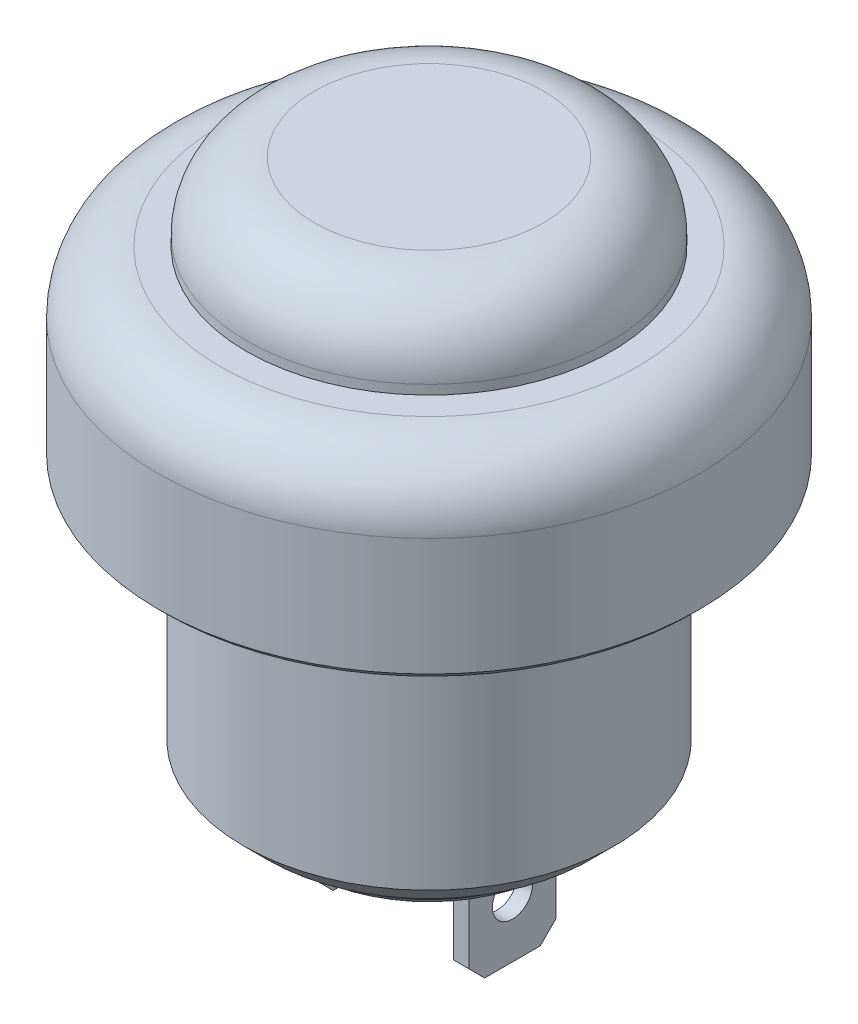
ISO-10303-21;
HEADER;
FILE_DESCRIPTION(('STEP AP214'),'2;1');
FILE_NAME('part.step','',(''),(''),'','','');
FILE_SCHEMA(('AUTOMOTIVE_DESIGN { 1 0 10303 214 1 1 1 1 }'));
ENDSEC;
DATA;
#1=APPLICATION_CONTEXT('core data for automotive mechanical design processes');
#2=APPLICATION_PROTOCOL_DEFINITION('international standard','automotive_design',2000,#1);
#3=PRODUCT_CONTEXT('',#1,'mechanical');
#4=PRODUCT('Part','Part','',(#3));
#5=PRODUCT_RELATED_PRODUCT_CATEGORY('part','',(#4));
#6=PRODUCT_DEFINITION_FORMATION('','',#4);
#7=PRODUCT_DEFINITION_CONTEXT('part definition',#1,'design');
#8=PRODUCT_DEFINITION('design','',#6,#7);
#9=PRODUCT_DEFINITION_SHAPE('','',#8);
#10=(LENGTH_UNIT() NAMED_UNIT(*) SI_UNIT(.MILLI.,.METRE.));
#11=(NAMED_UNIT(*) PLANE_ANGLE_UNIT() SI_UNIT($,.RADIAN.));
#12=(NAMED_UNIT(*) SI_UNIT($,.STERADIAN.) SOLID_ANGLE_UNIT());
#13=UNCERTAINTY_MEASURE_WITH_UNIT(LENGTH_MEASURE(1.E-05),#10,'distance_accuracy_value','');
#14=(GEOMETRIC_REPRESENTATION_CONTEXT(3) GLOBAL_UNCERTAINTY_ASSIGNED_CONTEXT((#13)) GLOBAL_UNIT_ASSIGNED_CONTEXT((#10,
#11,#12)) REPRESENTATION_CONTEXT('',''));
#15=CARTESIAN_POINT('',(0.,0.,0.));
#16=DIRECTION('',(0.,0.,1.));
#17=DIRECTION('',(1.,0.,0.));
#18=AXIS2_PLACEMENT_3D('',#15,#16,#17);
#19=CARTESIAN_POINT('',(0.,18.,0.));
#20=DIRECTION('',(0.,1.,0.));
#21=DIRECTION('',(0.,0.,1.));
#22=AXIS2_PLACEMENT_3D('',#19,#20,#21);
#23=PLANE('',#22);
#24=CARTESIAN_POINT('',(0.,18.,0.));
#25=DIRECTION('',(0.,-1.,0.));
#26=DIRECTION('',(1.,0.,0.));
#27=AXIS2_PLACEMENT_3D('',#24,#25,#26);
#28=CIRCLE('',#27,3.7);
#29=CARTESIAN_POINT('',(3.7,18.,0.));
#30=VERTEX_POINT('',#29);
#31=EDGE_CURVE('E208',#30,#30,#28,.T.);
#32=ORIENTED_EDGE('',*,*,#31,.F.);
#33=EDGE_LOOP('',(#32));
#34=FACE_BOUND('',#33,.T.);
#35=ADVANCED_FACE('F17',(#34),#23,.T.);
#36=CARTESIAN_POINT('',(0.,15.8,0.));
#37=DIRECTION('',(0.,1.,0.));
#38=DIRECTION('',(0.,0.,1.));
#39=AXIS2_PLACEMENT_3D('',#36,#37,#38);
#40=TOROIDAL_SURFACE('',#39,3.7,2.2);
#41=ORIENTED_EDGE('',*,*,#31,.T.);
#42=EDGE_LOOP('',(#41));
#43=FACE_BOUND('',#42,.T.);
#44=CARTESIAN_POINT('',(0.,15.8,0.));
#45=DIRECTION('',(0.,-1.,0.));
#46=DIRECTION('',(0.,0.,-1.));
#47=AXIS2_PLACEMENT_3D('',#44,#45,#46);
#48=CIRCLE('',#47,5.9);
#49=CARTESIAN_POINT('',(0.,15.8,-5.9));
#50=VERTEX_POINT('',#49);
#51=EDGE_CURVE('E199',#50,#50,#48,.T.);
#52=ORIENTED_EDGE('',*,*,#51,.F.);
#53=EDGE_LOOP('',(#52));
#54=FACE_BOUND('',#53,.T.);
#55=ADVANCED_FACE('F215',(#43,#54),#40,.T.);
#56=CARTESIAN_POINT('',(0.,18.,0.));
#57=DIRECTION('',(0.,-1.,0.));
#58=DIRECTION('',(0.,0.,-1.));
#59=AXIS2_PLACEMENT_3D('',#56,#57,#58);
#60=CYLINDRICAL_SURFACE('',#59,5.9);
#61=ORIENTED_EDGE('',*,*,#51,.T.);
#62=EDGE_LOOP('',(#61));
#63=FACE_BOUND('',#62,.T.);
#64=CARTESIAN_POINT('',(0.,15.5,0.));
#65=DIRECTION('',(0.,-1.,0.));
#66=DIRECTION('',(0.,0.,-1.));
#67=AXIS2_PLACEMENT_3D('',#64,#65,#66);
#68=CIRCLE('',#67,5.9);
#69=CARTESIAN_POINT('',(0.,15.5,-5.9));
#70=VERTEX_POINT('',#69);
#71=EDGE_CURVE('E21',#70,#70,#68,.T.);
#72=ORIENTED_EDGE('',*,*,#71,.F.);
#73=EDGE_LOOP('',(#72));
#74=FACE_BOUND('',#73,.T.);
#75=ADVANCED_FACE('F218',(#63,#74),#60,.T.);
#76=CARTESIAN_POINT('',(0.,15.5,0.));
#77=DIRECTION('',(0.,1.,0.));
#78=DIRECTION('',(0.,0.,1.));
#79=AXIS2_PLACEMENT_3D('',#76,#77,#78);
#80=PLANE('',#79);
#81=ORIENTED_EDGE('',*,*,#71,.T.);
#82=EDGE_LOOP('',(#81));
#83=FACE_BOUND('',#82,.T.);
#84=CARTESIAN_POINT('',(0.,15.5,0.));
#85=DIRECTION('',(0.,-1.,0.));
#86=DIRECTION('',(1.,0.,0.));
#87=AXIS2_PLACEMENT_3D('',#84,#85,#86);
#88=CIRCLE('',#87,6.75);
#89=CARTESIAN_POINT('',(6.75,15.5,0.));
#90=VERTEX_POINT('',#89);
#91=EDGE_CURVE('E177',#90,#90,#88,.T.);
#92=ORIENTED_EDGE('',*,*,#91,.F.);
#93=EDGE_LOOP('',(#92));
#94=FACE_BOUND('',#93,.T.);
#95=ADVANCED_FACE('F188',(#83,#94),#80,.T.);
#96=CARTESIAN_POINT('',(0.,13.5,0.));
#97=DIRECTION('',(0.,-1.,0.));
#98=DIRECTION('',(0.,0.,-1.));
#99=AXIS2_PLACEMENT_3D('',#96,#97,#98);
#100=TOROIDAL_SURFACE('',#99,6.75,2.);
#101=CARTESIAN_POINT('',(0.,13.5,0.));
#102=DIRECTION('',(0.,1.,0.));
#103=DIRECTION('',(0.,0.,1.));
#104=AXIS2_PLACEMENT_3D('',#101,#102,#103);
#105=CIRCLE('',#104,8.75);
#106=CARTESIAN_POINT('',(0.,13.5,8.75));
#107=VERTEX_POINT('',#106);
#108=EDGE_CURVE('E135',#107,#107,#105,.F.);
#109=ORIENTED_EDGE('',*,*,#108,.F.);
#110=EDGE_LOOP('',(#109));
#111=FACE_BOUND('',#110,.T.);
#112=ORIENTED_EDGE('',*,*,#91,.T.);
#113=EDGE_LOOP('',(#112));
#114=FACE_BOUND('',#113,.T.);
#115=ADVANCED_FACE('F183',(#111,#114),#100,.T.);
#116=CARTESIAN_POINT('',(2.575,-2.95,1.15));
#117=DIRECTION('',(0.,-0.707106781186548,0.707106781186547));
#118=DIRECTION('',(0.,-0.707106781186547,-0.707106781186548));
#119=AXIS2_PLACEMENT_3D('',#116,#117,#118);
#120=PLANE('',#119);
#121=DIRECTION('',(0.,-0.707106781186548,-0.707106781186548));
#122=VECTOR('',#121,1.);
#123=CARTESIAN_POINT('',(2.7,-2.7,1.4));
#124=LINE('',#123,#122);
#125=CARTESIAN_POINT('',(2.7,-2.7,1.4));
#126=VERTEX_POINT('',#125);
#127=CARTESIAN_POINT('',(2.7,-3.2,0.9));
#128=VERTEX_POINT('',#127);
#129=EDGE_CURVE('E112',#126,#128,#124,.T.);
#130=ORIENTED_EDGE('',*,*,#129,.F.);
#131=DIRECTION('',(1.,0.,0.));
#132=VECTOR('',#131,1.);
#133=CARTESIAN_POINT('',(2.7,-2.7,1.4));
#134=LINE('',#133,#132);
#135=CARTESIAN_POINT('',(2.2,-2.7,1.4));
#136=VERTEX_POINT('',#135);
#137=EDGE_CURVE('E108',#136,#126,#134,.T.);
#138=ORIENTED_EDGE('',*,*,#137,.F.);
#139=DIRECTION('',(0.,0.707106781186548,0.707106781186548));
#140=VECTOR('',#139,1.);
#141=CARTESIAN_POINT('',(2.2,-3.2,0.9));
#142=LINE('',#141,#140);
#143=CARTESIAN_POINT('',(2.2,-3.2,0.9));
#144=VERTEX_POINT('',#143);
#145=EDGE_CURVE('E105',#144,#136,#142,.T.);
#146=ORIENTED_EDGE('',*,*,#145,.F.);
#147=DIRECTION('',(1.,0.,0.));
#148=VECTOR('',#147,1.);
#149=CARTESIAN_POINT('',(2.45,-3.2,0.9));
#150=LINE('',#149,#148);
#151=EDGE_CURVE('E174',#144,#128,#150,.T.);
#152=ORIENTED_EDGE('',*,*,#151,.T.);
#153=EDGE_LOOP('',(#130,#138,#146,#152));
#154=FACE_BOUND('',#153,.T.);
#155=ADVANCED_FACE('F110',(#154),#120,.T.);
#156=CARTESIAN_POINT('',(2.45,-3.2,0.));
#157=DIRECTION('',(0.,1.,0.));
#158=DIRECTION('',(0.,0.,1.));
#159=AXIS2_PLACEMENT_3D('',#156,#157,#158);
#160=PLANE('',#159);
#161=DIRECTION('',(0.,0.,1.));
#162=VECTOR('',#161,1.);
#163=CARTESIAN_POINT('',(2.2,-3.2,1.4));
#164=LINE('',#163,#162);
#165=CARTESIAN_POINT('',(2.2,-3.2,-0.9));
#166=VERTEX_POINT('',#165);
#167=EDGE_CURVE('E133',#166,#144,#164,.T.);
#168=ORIENTED_EDGE('',*,*,#167,.F.);
#169=DIRECTION('',(1.,0.,0.));
#170=VECTOR('',#169,1.);
#171=CARTESIAN_POINT('',(2.325,-3.2,-0.9));
#172=LINE('',#171,#170);
#173=CARTESIAN_POINT('',(2.7,-3.2,-0.9));
#174=VERTEX_POINT('',#173);
#175=EDGE_CURVE('E171',#174,#166,#172,.F.);
#176=ORIENTED_EDGE('',*,*,#175,.F.);
#177=DIRECTION('',(0.,0.,-1.));
#178=VECTOR('',#177,1.);
#179=CARTESIAN_POINT('',(2.7,-3.2,-1.4));
#180=LINE('',#179,#178);
#181=EDGE_CURVE('E285',#128,#174,#180,.T.);
#182=ORIENTED_EDGE('',*,*,#181,.F.);
#183=ORIENTED_EDGE('',*,*,#151,.F.);
#184=EDGE_LOOP('',(#168,#176,#182,#183));
#185=FACE_BOUND('',#184,.T.);
#186=ADVANCED_FACE('F310',(#185),#160,.F.);
#187=CARTESIAN_POINT('',(2.325,-2.95,-1.15));
#188=DIRECTION('',(0.,-0.707106781186548,-0.707106781186547));
#189=DIRECTION('',(0.,0.707106781186547,-0.707106781186548));
#190=AXIS2_PLACEMENT_3D('',#187,#188,#189);
#191=PLANE('',#190);
#192=DIRECTION('',(0.,-0.707106781186548,0.707106781186548));
#193=VECTOR('',#192,1.);
#194=CARTESIAN_POINT('',(2.2,-2.7,-1.4));
#195=LINE('',#194,#193);
#196=CARTESIAN_POINT('',(2.2,-2.7,-1.4));
#197=VERTEX_POINT('',#196);
#198=EDGE_CURVE('E287',#197,#166,#195,.T.);
#199=ORIENTED_EDGE('',*,*,#198,.F.);
#200=DIRECTION('',(-1.,0.,0.));
#201=VECTOR('',#200,1.);
#202=CARTESIAN_POINT('',(2.2,-2.7,-1.4));
#203=LINE('',#202,#201);
#204=CARTESIAN_POINT('',(2.7,-2.7,-1.4));
#205=VERTEX_POINT('',#204);
#206=EDGE_CURVE('E168',#205,#197,#203,.T.);
#207=ORIENTED_EDGE('',*,*,#206,.F.);
#208=DIRECTION('',(0.,0.707106781186548,-0.707106781186548));
#209=VECTOR('',#208,1.);
#210=CARTESIAN_POINT('',(2.7,-3.2,-0.9));
#211=LINE('',#210,#209);
#212=EDGE_CURVE('E306',#174,#205,#211,.T.);
#213=ORIENTED_EDGE('',*,*,#212,.F.);
#214=ORIENTED_EDGE('',*,*,#175,.T.);
#215=EDGE_LOOP('',(#199,#207,#213,#214));
#216=FACE_BOUND('',#215,.T.);
#217=ADVANCED_FACE('F305',(#216),#191,.T.);
#218=CARTESIAN_POINT('',(2.2,0.,-1.4));
#219=DIRECTION('',(0.,0.,-1.));
#220=DIRECTION('',(-1.,0.,0.));
#221=AXIS2_PLACEMENT_3D('',#218,#219,#220);
#222=PLANE('',#221);
#223=DIRECTION('',(-1.,0.,0.));
#224=VECTOR('',#223,1.);
#225=CARTESIAN_POINT('',(2.2,0.,-1.4));
#226=LINE('',#225,#224);
#227=CARTESIAN_POINT('',(2.2,0.,-1.4));
#228=VERTEX_POINT('',#227);
#229=CARTESIAN_POINT('',(2.7,0.,-1.4));
#230=VERTEX_POINT('',#229);
#231=EDGE_CURVE('E118',#228,#230,#226,.F.);
#232=ORIENTED_EDGE('',*,*,#231,.T.);
#233=DIRECTION('',(0.,1.,0.));
#234=VECTOR('',#233,1.);
#235=CARTESIAN_POINT('',(2.7,0.,-1.4));
#236=LINE('',#235,#234);
#237=EDGE_CURVE('E301',#205,#230,#236,.T.);
#238=ORIENTED_EDGE('',*,*,#237,.F.);
#239=ORIENTED_EDGE('',*,*,#206,.T.);
#240=DIRECTION('',(0.,1.,0.));
#241=VECTOR('',#240,1.);
#242=CARTESIAN_POINT('',(2.2,0.,-1.4));
#243=LINE('',#242,#241);
#244=EDGE_CURVE('E127',#228,#197,#243,.F.);
#245=ORIENTED_EDGE('',*,*,#244,.F.);
#246=EDGE_LOOP('',(#232,#238,#239,#245));
#247=FACE_BOUND('',#246,.T.);
#248=ADVANCED_FACE('F298',(#247),#222,.T.);
#249=CARTESIAN_POINT('',(2.7,0.,1.4));
#250=DIRECTION('',(0.,0.,1.));
#251=DIRECTION('',(1.,0.,0.));
#252=AXIS2_PLACEMENT_3D('',#249,#250,#251);
#253=PLANE('',#252);
#254=DIRECTION('',(1.,0.,0.));
#255=VECTOR('',#254,1.);
#256=CARTESIAN_POINT('',(2.7,0.,1.4));
#257=LINE('',#256,#255);
#258=CARTESIAN_POINT('',(2.7,0.,1.4));
#259=VERTEX_POINT('',#258);
#260=CARTESIAN_POINT('',(2.2,0.,1.4));
#261=VERTEX_POINT('',#260);
#262=EDGE_CURVE('E117',#259,#261,#257,.F.);
#263=ORIENTED_EDGE('',*,*,#262,.T.);
#264=DIRECTION('',(0.,1.,0.));
#265=VECTOR('',#264,1.);
#266=CARTESIAN_POINT('',(2.2,0.,1.4));
#267=LINE('',#266,#265);
#268=EDGE_CURVE('E121',#136,#261,#267,.T.);
#269=ORIENTED_EDGE('',*,*,#268,.F.);
#270=ORIENTED_EDGE('',*,*,#137,.T.);
#271=DIRECTION('',(0.,1.,0.));
#272=VECTOR('',#271,1.);
#273=CARTESIAN_POINT('',(2.7,0.,1.4));
#274=LINE('',#273,#272);
#275=EDGE_CURVE('E277',#259,#126,#274,.F.);
#276=ORIENTED_EDGE('',*,*,#275,.F.);
#277=EDGE_LOOP('',(#263,#269,#270,#276));
#278=FACE_BOUND('',#277,.T.);
#279=ADVANCED_FACE('F122',(#278),#253,.T.);
#280=CARTESIAN_POINT('',(2.7,-1.35,0.));
#281=DIRECTION('',(-1.,0.,0.));
#282=DIRECTION('',(0.,0.,1.));
#283=AXIS2_PLACEMENT_3D('',#280,#281,#282);
#284=CYLINDRICAL_SURFACE('',#283,0.65);
#285=CARTESIAN_POINT('',(2.7,-1.35,0.));
#286=DIRECTION('',(-1.,0.,0.));
#287=DIRECTION('',(0.,0.,1.));
#288=AXIS2_PLACEMENT_3D('',#285,#286,#287);
#289=CIRCLE('',#288,0.65);
#290=CARTESIAN_POINT('',(2.7,-1.35,0.65));
#291=VERTEX_POINT('',#290);
#292=EDGE_CURVE('E273',#291,#291,#289,.T.);
#293=ORIENTED_EDGE('',*,*,#292,.F.);
#294=EDGE_LOOP('',(#293));
#295=FACE_BOUND('',#294,.T.);
#296=CARTESIAN_POINT('',(2.2,-1.35,0.));
#297=DIRECTION('',(-1.,0.,0.));
#298=DIRECTION('',(0.,0.,1.));
#299=AXIS2_PLACEMENT_3D('',#296,#297,#298);
#300=CIRCLE('',#299,0.65);
#301=CARTESIAN_POINT('',(2.2,-1.35,0.65));
#302=VERTEX_POINT('',#301);
#303=EDGE_CURVE('E278',#302,#302,#300,.F.);
#304=ORIENTED_EDGE('',*,*,#303,.F.);
#305=EDGE_LOOP('',(#304));
#306=FACE_BOUND('',#305,.T.);
#307=ADVANCED_FACE('F647',(#295,#306),#284,.F.);
#308=CARTESIAN_POINT('',(-2.575,-2.95,-1.15));
#309=DIRECTION('',(0.,-0.707106781186548,-0.707106781186548));
#310=DIRECTION('',(0.,0.707106781186548,-0.707106781186548));
#311=AXIS2_PLACEMENT_3D('',#308,#309,#310);
#312=PLANE('',#311);
#313=DIRECTION('',(0.,-0.707106781186548,0.707106781186547));
#314=VECTOR('',#313,1.);
#315=CARTESIAN_POINT('',(-2.7,-2.7,-1.4));
#316=LINE('',#315,#314);
#317=CARTESIAN_POINT('',(-2.7,-2.7,-1.4));
#318=VERTEX_POINT('',#317);
#319=CARTESIAN_POINT('',(-2.7,-3.2,-0.9));
#320=VERTEX_POINT('',#319);
#321=EDGE_CURVE('E271',#318,#320,#316,.T.);
#322=ORIENTED_EDGE('',*,*,#321,.F.);
#323=DIRECTION('',(-1.,0.,0.));
#324=VECTOR('',#323,1.);
#325=CARTESIAN_POINT('',(-2.7,-2.7,-1.4));
#326=LINE('',#325,#324);
#327=CARTESIAN_POINT('',(-2.2,-2.7,-1.4));
#328=VERTEX_POINT('',#327);
#329=EDGE_CURVE('E147',#328,#318,#326,.T.);
#330=ORIENTED_EDGE('',*,*,#329,.F.);
#331=DIRECTION('',(0.,0.707106781186548,-0.707106781186548));
#332=VECTOR('',#331,1.);
#333=CARTESIAN_POINT('',(-2.2,-3.2,-0.9));
#334=LINE('',#333,#332);
#335=CARTESIAN_POINT('',(-2.2,-3.2,-0.9));
#336=VERTEX_POINT('',#335);
#337=EDGE_CURVE('E276',#336,#328,#334,.T.);
#338=ORIENTED_EDGE('',*,*,#337,.F.);
#339=DIRECTION('',(1.,0.,0.));
#340=VECTOR('',#339,1.);
#341=CARTESIAN_POINT('',(-2.45,-3.2,-0.900000000000001));
#342=LINE('',#341,#340);
#343=EDGE_CURVE('E160',#320,#336,#342,.T.);
#344=ORIENTED_EDGE('',*,*,#343,.F.);
#345=EDGE_LOOP('',(#322,#330,#338,#344));
#346=FACE_BOUND('',#345,.T.);
#347=ADVANCED_FACE('F381',(#346),#312,.T.);
#348=CARTESIAN_POINT('',(-2.45,-3.2,0.));
#349=DIRECTION('',(0.,-1.,0.));
#350=DIRECTION('',(0.,0.,-1.));
#351=AXIS2_PLACEMENT_3D('',#348,#349,#350);
#352=PLANE('',#351);
#353=DIRECTION('',(1.,0.,0.));
#354=VECTOR('',#353,1.);
#355=CARTESIAN_POINT('',(-2.325,-3.2,0.899999999999999));
#356=LINE('',#355,#354);
#357=CARTESIAN_POINT('',(-2.7,-3.2,0.9));
#358=VERTEX_POINT('',#357);
#359=CARTESIAN_POINT('',(-2.2,-3.2,0.9));
#360=VERTEX_POINT('',#359);
#361=EDGE_CURVE('E157',#358,#360,#356,.T.);
#362=ORIENTED_EDGE('',*,*,#361,.F.);
#363=DIRECTION('',(0.,0.,1.));
#364=VECTOR('',#363,1.);
#365=CARTESIAN_POINT('',(-2.7,-3.2,1.4));
#366=LINE('',#365,#364);
#367=EDGE_CURVE('E354',#320,#358,#366,.T.);
#368=ORIENTED_EDGE('',*,*,#367,.F.);
#369=ORIENTED_EDGE('',*,*,#343,.T.);
#370=DIRECTION('',(0.,0.,-1.));
#371=VECTOR('',#370,1.);
#372=CARTESIAN_POINT('',(-2.2,-3.2,0.));
#373=LINE('',#372,#371);
#374=EDGE_CURVE('E272',#360,#336,#373,.T.);
#375=ORIENTED_EDGE('',*,*,#374,.F.);
#376=EDGE_LOOP('',(#362,#368,#369,#375));
#377=FACE_BOUND('',#376,.T.);
#378=ADVANCED_FACE('F384',(#377),#352,.T.);
#379=CARTESIAN_POINT('',(-2.325,-2.95,1.15));
#380=DIRECTION('',(0.,-0.707106781186548,0.707106781186548));
#381=DIRECTION('',(0.,-0.707106781186548,-0.707106781186548));
#382=AXIS2_PLACEMENT_3D('',#379,#380,#381);
#383=PLANE('',#382);
#384=DIRECTION('',(0.,-0.707106781186548,-0.707106781186548));
#385=VECTOR('',#384,1.);
#386=CARTESIAN_POINT('',(-2.2,-2.7,1.4));
#387=LINE('',#386,#385);
#388=CARTESIAN_POINT('',(-2.2,-2.7,1.4));
#389=VERTEX_POINT('',#388);
#390=EDGE_CURVE('E364',#389,#360,#387,.T.);
#391=ORIENTED_EDGE('',*,*,#390,.F.);
#392=DIRECTION('',(1.,0.,0.));
#393=VECTOR('',#392,1.);
#394=CARTESIAN_POINT('',(-2.2,-2.7,1.4));
#395=LINE('',#394,#393);
#396=CARTESIAN_POINT('',(-2.7,-2.7,1.4));
#397=VERTEX_POINT('',#396);
#398=EDGE_CURVE('E154',#397,#389,#395,.T.);
#399=ORIENTED_EDGE('',*,*,#398,.F.);
#400=DIRECTION('',(0.,0.707106781186547,0.707106781186548));
#401=VECTOR('',#400,1.);
#402=CARTESIAN_POINT('',(-2.7,-3.2,0.899999999999999));
#403=LINE('',#402,#401);
#404=EDGE_CURVE('E350',#358,#397,#403,.T.);
#405=ORIENTED_EDGE('',*,*,#404,.F.);
#406=ORIENTED_EDGE('',*,*,#361,.T.);
#407=EDGE_LOOP('',(#391,#399,#405,#406));
#408=FACE_BOUND('',#407,.T.);
#409=ADVANCED_FACE('F623',(#408),#383,.T.);
#410=CARTESIAN_POINT('',(-2.2,0.,1.4));
#411=DIRECTION('',(0.,0.,1.));
#412=DIRECTION('',(1.,0.,0.));
#413=AXIS2_PLACEMENT_3D('',#410,#411,#412);
#414=PLANE('',#413);
#415=DIRECTION('',(1.,0.,0.));
#416=VECTOR('',#415,1.);
#417=CARTESIAN_POINT('',(-2.2,0.,1.4));
#418=LINE('',#417,#416);
#419=CARTESIAN_POINT('',(-2.2,0.,1.4));
#420=VERTEX_POINT('',#419);
#421=CARTESIAN_POINT('',(-2.7,0.,1.4));
#422=VERTEX_POINT('',#421);
#423=EDGE_CURVE('E151',#420,#422,#418,.F.);
#424=ORIENTED_EDGE('',*,*,#423,.T.);
#425=DIRECTION('',(0.,1.,0.));
#426=VECTOR('',#425,1.);
#427=CARTESIAN_POINT('',(-2.7,0.,1.4));
#428=LINE('',#427,#426);
#429=EDGE_CURVE('E346',#397,#422,#428,.T.);
#430=ORIENTED_EDGE('',*,*,#429,.F.);
#431=ORIENTED_EDGE('',*,*,#398,.T.);
#432=DIRECTION('',(0.,1.,0.));
#433=VECTOR('',#432,1.);
#434=CARTESIAN_POINT('',(-2.2,0.,1.4));
#435=LINE('',#434,#433);
#436=EDGE_CURVE('E368',#420,#389,#435,.F.);
#437=ORIENTED_EDGE('',*,*,#436,.F.);
#438=EDGE_LOOP('',(#424,#430,#431,#437));
#439=FACE_BOUND('',#438,.T.);
#440=ADVANCED_FACE('F615',(#439),#414,.T.);
#441=CARTESIAN_POINT('',(-2.7,0.,-1.4));
#442=DIRECTION('',(0.,0.,-1.));
#443=DIRECTION('',(-1.,0.,0.));
#444=AXIS2_PLACEMENT_3D('',#441,#442,#443);
#445=PLANE('',#444);
#446=DIRECTION('',(-1.,0.,0.));
#447=VECTOR('',#446,1.);
#448=CARTESIAN_POINT('',(-2.7,0.,-1.4));
#449=LINE('',#448,#447);
#450=CARTESIAN_POINT('',(-2.7,0.,-1.4));
#451=VERTEX_POINT('',#450);
#452=CARTESIAN_POINT('',(-2.2,0.,-1.4));
#453=VERTEX_POINT('',#452);
#454=EDGE_CURVE('E37',#451,#453,#449,.F.);
#455=ORIENTED_EDGE('',*,*,#454,.T.);
#456=DIRECTION('',(0.,1.,0.));
#457=VECTOR('',#456,1.);
#458=CARTESIAN_POINT('',(-2.2,0.,-1.4));
#459=LINE('',#458,#457);
#460=EDGE_CURVE('E371',#328,#453,#459,.T.);
#461=ORIENTED_EDGE('',*,*,#460,.F.);
#462=ORIENTED_EDGE('',*,*,#329,.T.);
#463=DIRECTION('',(0.,1.,0.));
#464=VECTOR('',#463,1.);
#465=CARTESIAN_POINT('',(-2.7,0.,-1.4));
#466=LINE('',#465,#464);
#467=EDGE_CURVE('E266',#451,#318,#466,.F.);
#468=ORIENTED_EDGE('',*,*,#467,.F.);
#469=EDGE_LOOP('',(#455,#461,#462,#468));
#470=FACE_BOUND('',#469,.T.);
#471=ADVANCED_FACE('F390',(#470),#445,.T.);
#472=CARTESIAN_POINT('',(2.7,-1.35,0.));
#473=DIRECTION('',(-1.,0.,0.));
#474=DIRECTION('',(0.,0.,1.));
#475=AXIS2_PLACEMENT_3D('',#472,#473,#474);
#476=CYLINDRICAL_SURFACE('',#475,0.65);
#477=CARTESIAN_POINT('',(-2.7,-1.35,0.));
#478=DIRECTION('',(-1.,0.,0.));
#479=DIRECTION('',(0.,0.,1.));
#480=AXIS2_PLACEMENT_3D('',#477,#478,#479);
#481=CIRCLE('',#480,0.65);
#482=CARTESIAN_POINT('',(-2.7,-1.35,0.65));
#483=VERTEX_POINT('',#482);
#484=EDGE_CURVE('E261',#483,#483,#481,.F.);
#485=ORIENTED_EDGE('',*,*,#484,.F.);
#486=EDGE_LOOP('',(#485));
#487=FACE_BOUND('',#486,.T.);
#488=CARTESIAN_POINT('',(-2.2,-1.35,0.));
#489=DIRECTION('',(-1.,0.,0.));
#490=DIRECTION('',(0.,0.,1.));
#491=AXIS2_PLACEMENT_3D('',#488,#489,#490);
#492=CIRCLE('',#491,0.65);
#493=CARTESIAN_POINT('',(-2.2,-1.35,0.65));
#494=VERTEX_POINT('',#493);
#495=EDGE_CURVE('E267',#494,#494,#492,.T.);
#496=ORIENTED_EDGE('',*,*,#495,.F.);
#497=EDGE_LOOP('',(#496));
#498=FACE_BOUND('',#497,.T.);
#499=ADVANCED_FACE('F597',(#487,#498),#476,.F.);
#500=CARTESIAN_POINT('',(0.,0.,0.));
#501=DIRECTION('',(0.,1.,0.));
#502=DIRECTION('',(0.,0.,1.));
#503=AXIS2_PLACEMENT_3D('',#500,#501,#502);
#504=CYLINDRICAL_SURFACE('',#503,8.75);
#505=CARTESIAN_POINT('',(0.,9.70000000008975,0.));
#506=DIRECTION('',(0.,1.,0.));
#507=DIRECTION('',(-1.,0.,0.));
#508=AXIS2_PLACEMENT_3D('',#505,#506,#507);
#509=CIRCLE('',#508,8.74999999991026);
#510=CARTESIAN_POINT('',(-8.74999999991026,9.70000000008975,0.));
#511=VERTEX_POINT('',#510);
#512=EDGE_CURVE('E265',#511,#511,#509,.F.);
#513=ORIENTED_EDGE('',*,*,#512,.F.);
#514=EDGE_LOOP('',(#513));
#515=FACE_BOUND('',#514,.T.);
#516=ORIENTED_EDGE('',*,*,#108,.T.);
#517=EDGE_LOOP('',(#516));
#518=FACE_BOUND('',#517,.T.);
#519=ADVANCED_FACE('F589',(#515,#518),#504,.T.);
#520=CARTESIAN_POINT('',(2.2,0.,1.4));
#521=DIRECTION('',(-1.,0.,0.));
#522=DIRECTION('',(0.,0.,1.));
#523=AXIS2_PLACEMENT_3D('',#520,#521,#522);
#524=PLANE('',#523);
#525=ORIENTED_EDGE('',*,*,#303,.T.);
#526=EDGE_LOOP('',(#525));
#527=FACE_BOUND('',#526,.T.);
#528=ORIENTED_EDGE('',*,*,#198,.T.);
#529=ORIENTED_EDGE('',*,*,#167,.T.);
#530=ORIENTED_EDGE('',*,*,#145,.T.);
#531=ORIENTED_EDGE('',*,*,#268,.T.);
#532=DIRECTION('',(0.,0.,1.));
#533=VECTOR('',#532,1.);
#534=CARTESIAN_POINT('',(2.2,0.,0.));
#535=LINE('',#534,#533);
#536=EDGE_CURVE('E296',#261,#228,#535,.F.);
#537=ORIENTED_EDGE('',*,*,#536,.T.);
#538=ORIENTED_EDGE('',*,*,#244,.T.);
#539=EDGE_LOOP('',(#528,#529,#530,#531,#537,#538));
#540=FACE_BOUND('',#539,.T.);
#541=ADVANCED_FACE('F131',(#527,#540),#524,.T.);
#542=CARTESIAN_POINT('',(2.7,0.,-1.4));
#543=DIRECTION('',(1.,0.,0.));
#544=DIRECTION('',(0.,0.,-1.));
#545=AXIS2_PLACEMENT_3D('',#542,#543,#544);
#546=PLANE('',#545);
#547=ORIENTED_EDGE('',*,*,#292,.T.);
#548=EDGE_LOOP('',(#547));
#549=FACE_BOUND('',#548,.T.);
#550=DIRECTION('',(0.,0.,1.));
#551=VECTOR('',#550,1.);
#552=CARTESIAN_POINT('',(2.7,0.,0.));
#553=LINE('',#552,#551);
#554=EDGE_CURVE('E316',#230,#259,#553,.T.);
#555=ORIENTED_EDGE('',*,*,#554,.T.);
#556=ORIENTED_EDGE('',*,*,#275,.T.);
#557=ORIENTED_EDGE('',*,*,#129,.T.);
#558=ORIENTED_EDGE('',*,*,#181,.T.);
#559=ORIENTED_EDGE('',*,*,#212,.T.);
#560=ORIENTED_EDGE('',*,*,#237,.T.);
#561=EDGE_LOOP('',(#555,#556,#557,#558,#559,#560));
#562=FACE_BOUND('',#561,.T.);
#563=ADVANCED_FACE('F314',(#549,#562),#546,.T.);
#564=CARTESIAN_POINT('',(-2.2,0.,0.));
#565=DIRECTION('',(1.,0.,0.));
#566=DIRECTION('',(0.,0.,-1.));
#567=AXIS2_PLACEMENT_3D('',#564,#565,#566);
#568=PLANE('',#567);
#569=ORIENTED_EDGE('',*,*,#495,.T.);
#570=EDGE_LOOP('',(#569));
#571=FACE_BOUND('',#570,.T.);
#572=ORIENTED_EDGE('',*,*,#390,.T.);
#573=ORIENTED_EDGE('',*,*,#374,.T.);
#574=ORIENTED_EDGE('',*,*,#337,.T.);
#575=ORIENTED_EDGE('',*,*,#460,.T.);
#576=DIRECTION('',(0.,0.,1.));
#577=VECTOR('',#576,1.);
#578=CARTESIAN_POINT('',(-2.2,0.,0.));
#579=LINE('',#578,#577);
#580=EDGE_CURVE('E329',#453,#420,#579,.T.);
#581=ORIENTED_EDGE('',*,*,#580,.T.);
#582=ORIENTED_EDGE('',*,*,#436,.T.);
#583=EDGE_LOOP('',(#572,#573,#574,#575,#581,#582));
#584=FACE_BOUND('',#583,.T.);
#585=ADVANCED_FACE('F378',(#571,#584),#568,.T.);
#586=CARTESIAN_POINT('',(-2.7,0.,1.4));
#587=DIRECTION('',(-1.,0.,0.));
#588=DIRECTION('',(0.,0.,1.));
#589=AXIS2_PLACEMENT_3D('',#586,#587,#588);
#590=PLANE('',#589);
#591=ORIENTED_EDGE('',*,*,#484,.T.);
#592=EDGE_LOOP('',(#591));
#593=FACE_BOUND('',#592,.T.);
#594=DIRECTION('',(0.,0.,1.));
#595=VECTOR('',#594,1.);
#596=CARTESIAN_POINT('',(-2.7,0.,0.));
#597=LINE('',#596,#595);
#598=EDGE_CURVE('E260',#422,#451,#597,.F.);
#599=ORIENTED_EDGE('',*,*,#598,.T.);
#600=ORIENTED_EDGE('',*,*,#467,.T.);
#601=ORIENTED_EDGE('',*,*,#321,.T.);
#602=ORIENTED_EDGE('',*,*,#367,.T.);
#603=ORIENTED_EDGE('',*,*,#404,.T.);
#604=ORIENTED_EDGE('',*,*,#429,.T.);
#605=EDGE_LOOP('',(#599,#600,#601,#602,#603,#604));
#606=FACE_BOUND('',#605,.T.);
#607=ADVANCED_FACE('F388',(#593,#606),#590,.T.);
#608=CARTESIAN_POINT('',(0.,9.70000000008975,0.));
#609=DIRECTION('',(0.,1.,0.));
#610=DIRECTION('',(0.,0.,1.));
#611=AXIS2_PLACEMENT_3D('',#608,#609,#610);
#612=CONICAL_SURFACE('',#611,8.74999999991026,0.785398162500002);
#613=ORIENTED_EDGE('',*,*,#512,.T.);
#614=EDGE_LOOP('',(#613));
#615=FACE_BOUND('',#614,.T.);
#616=CARTESIAN_POINT('',(0.,9.49999999991025,0.));
#617=DIRECTION('',(0.,1.,0.));
#618=DIRECTION('',(0.,0.,1.));
#619=AXIS2_PLACEMENT_3D('',#616,#617,#618);
#620=CIRCLE('',#619,8.55000000008974);
#621=CARTESIAN_POINT('',(0.,9.49999999991025,8.55000000008974));
#622=VERTEX_POINT('',#621);
#623=EDGE_CURVE('E256',#622,#622,#620,.T.);
#624=ORIENTED_EDGE('',*,*,#623,.T.);
#625=EDGE_LOOP('',(#624));
#626=FACE_BOUND('',#625,.T.);
#627=ADVANCED_FACE('F423',(#615,#626),#612,.T.);
#628=CARTESIAN_POINT('',(0.,0.,0.));
#629=DIRECTION('',(0.,1.,0.));
#630=DIRECTION('',(0.,0.,1.));
#631=AXIS2_PLACEMENT_3D('',#628,#629,#630);
#632=PLANE('',#631);
#633=ORIENTED_EDGE('',*,*,#598,.F.);
#634=ORIENTED_EDGE('',*,*,#423,.F.);
#635=ORIENTED_EDGE('',*,*,#580,.F.);
#636=ORIENTED_EDGE('',*,*,#454,.F.);
#637=EDGE_LOOP('',(#633,#634,#635,#636));
#638=FACE_BOUND('',#637,.T.);
#639=ORIENTED_EDGE('',*,*,#554,.F.);
#640=ORIENTED_EDGE('',*,*,#231,.F.);
#641=ORIENTED_EDGE('',*,*,#536,.F.);
#642=ORIENTED_EDGE('',*,*,#262,.F.);
#643=EDGE_LOOP('',(#639,#640,#641,#642));
#644=FACE_BOUND('',#643,.T.);
#645=CARTESIAN_POINT('',(0.,-5.6843418860808E-11,0.));
#646=DIRECTION('',(0.,1.,0.));
#647=DIRECTION('',(0.,0.,1.));
#648=AXIS2_PLACEMENT_3D('',#645,#646,#647);
#649=CIRCLE('',#648,4.05000000006339);
#650=CARTESIAN_POINT('',(0.,-5.68434317755692E-11,4.05000000006339));
#651=VERTEX_POINT('',#650);
#652=EDGE_CURVE('E252',#651,#651,#649,.T.);
#653=ORIENTED_EDGE('',*,*,#652,.F.);
#654=EDGE_LOOP('',(#653));
#655=FACE_BOUND('',#654,.T.);
#656=ADVANCED_FACE('F326',(#638,#644,#655),#632,.F.);
#657=CARTESIAN_POINT('',(0.,9.5,0.));
#658=DIRECTION('',(0.,1.,0.));
#659=DIRECTION('',(0.,0.,1.));
#660=AXIS2_PLACEMENT_3D('',#657,#658,#659);
#661=PLANE('',#660);
#662=CARTESIAN_POINT('',(0.,9.5,0.));
#663=DIRECTION('',(0.,1.,0.));
#664=DIRECTION('',(0.,0.,1.));
#665=AXIS2_PLACEMENT_3D('',#662,#663,#664);
#666=CIRCLE('',#665,6.65);
#667=CARTESIAN_POINT('',(0.,9.5,6.65));
#668=VERTEX_POINT('',#667);
#669=EDGE_CURVE('E247',#668,#668,#666,.F.);
#670=ORIENTED_EDGE('',*,*,#669,.F.);
#671=EDGE_LOOP('',(#670));
#672=FACE_BOUND('',#671,.T.);
#673=ORIENTED_EDGE('',*,*,#623,.F.);
#674=EDGE_LOOP('',(#673));
#675=FACE_BOUND('',#674,.T.);
#676=ADVANCED_FACE('F417',(#672,#675),#661,.F.);
#677=CARTESIAN_POINT('',(0.,0.199999999949796,0.));
#678=DIRECTION('',(0.,1.,0.));
#679=DIRECTION('',(0.,0.,1.));
#680=AXIS2_PLACEMENT_3D('',#677,#678,#679);
#681=CONICAL_SURFACE('',#680,4.24999999972897,0.785398162544797);
#682=ORIENTED_EDGE('',*,*,#652,.T.);
#683=EDGE_LOOP('',(#682));
#684=FACE_BOUND('',#683,.T.);
#685=CARTESIAN_POINT('',(0.,0.2,0.));
#686=DIRECTION('',(0.,1.,0.));
#687=DIRECTION('',(0.,0.,1.));
#688=AXIS2_PLACEMENT_3D('',#685,#686,#687);
#689=CIRCLE('',#688,4.25);
#690=CARTESIAN_POINT('',(0.,0.2,4.25));
#691=VERTEX_POINT('',#690);
#692=EDGE_CURVE('E251',#691,#691,#689,.T.);
#693=ORIENTED_EDGE('',*,*,#692,.F.);
#694=EDGE_LOOP('',(#693));
#695=FACE_BOUND('',#694,.T.);
#696=ADVANCED_FACE('F413',(#684,#695),#681,.T.);
#697=CARTESIAN_POINT('',(0.,8.6,0.));
#698=DIRECTION('',(0.,1.,0.));
#699=DIRECTION('',(0.,0.,1.));
#700=AXIS2_PLACEMENT_3D('',#697,#698,#699);
#701=CYLINDRICAL_SURFACE('',#700,6.65);
#702=CARTESIAN_POINT('',(0.,8.8000000001216,0.));
#703=DIRECTION('',(0.,1.,0.));
#704=DIRECTION('',(-1.,0.,0.));
#705=AXIS2_PLACEMENT_3D('',#702,#703,#704);
#706=CIRCLE('',#705,6.64999999992233);
#707=CARTESIAN_POINT('',(-6.64999999992233,8.8000000001216,0.));
#708=VERTEX_POINT('',#707);
#709=EDGE_CURVE('E246',#708,#708,#706,.F.);
#710=ORIENTED_EDGE('',*,*,#709,.F.);
#711=EDGE_LOOP('',(#710));
#712=FACE_BOUND('',#711,.T.);
#713=ORIENTED_EDGE('',*,*,#669,.T.);
#714=EDGE_LOOP('',(#713));
#715=FACE_BOUND('',#714,.T.);
#716=ADVANCED_FACE('F409',(#712,#715),#701,.T.);
#717=CARTESIAN_POINT('',(0.,0.,0.));
#718=DIRECTION('',(0.,1.,0.));
#719=DIRECTION('',(0.,0.,1.));
#720=AXIS2_PLACEMENT_3D('',#717,#718,#719);
#721=CYLINDRICAL_SURFACE('',#720,4.25);
#722=ORIENTED_EDGE('',*,*,#692,.T.);
#723=EDGE_LOOP('',(#722));
#724=FACE_BOUND('',#723,.T.);
#725=CARTESIAN_POINT('',(0.,0.9,0.));
#726=DIRECTION('',(0.,1.,0.));
#727=DIRECTION('',(0.,0.,1.));
#728=AXIS2_PLACEMENT_3D('',#725,#726,#727);
#729=CIRCLE('',#728,4.25);
#730=CARTESIAN_POINT('',(0.,0.9,4.25));
#731=VERTEX_POINT('',#730);
#732=EDGE_CURVE('E242',#731,#731,#729,.F.);
#733=ORIENTED_EDGE('',*,*,#732,.T.);
#734=EDGE_LOOP('',(#733));
#735=FACE_BOUND('',#734,.T.);
#736=ADVANCED_FACE('F412',(#724,#735),#721,.T.);
#737=CARTESIAN_POINT('',(0.,8.8000000001216,0.));
#738=DIRECTION('',(0.,1.,0.));
#739=DIRECTION('',(0.,0.,1.));
#740=AXIS2_PLACEMENT_3D('',#737,#738,#739);
#741=CONICAL_SURFACE('',#740,6.64999999992233,0.785398162544797);
#742=CARTESIAN_POINT('',(0.,8.59999999988759,0.));
#743=DIRECTION('',(0.,1.,0.));
#744=DIRECTION('',(0.,0.,1.));
#745=AXIS2_PLACEMENT_3D('',#742,#743,#744);
#746=CIRCLE('',#745,6.45000000002938);
#747=CARTESIAN_POINT('',(0.,8.59999999988759,6.45000000002938));
#748=VERTEX_POINT('',#747);
#749=EDGE_CURVE('E238',#748,#748,#746,.T.);
#750=ORIENTED_EDGE('',*,*,#749,.T.);
#751=EDGE_LOOP('',(#750));
#752=FACE_BOUND('',#751,.T.);
#753=ORIENTED_EDGE('',*,*,#709,.T.);
#754=EDGE_LOOP('',(#753));
#755=FACE_BOUND('',#754,.T.);
#756=ADVANCED_FACE('F407',(#752,#755),#741,.T.);
#757=CARTESIAN_POINT('',(0.,0.9,0.));
#758=DIRECTION('',(0.,1.,0.));
#759=DIRECTION('',(0.,0.,1.));
#760=AXIS2_PLACEMENT_3D('',#757,#758,#759);
#761=PLANE('',#760);
#762=ORIENTED_EDGE('',*,*,#732,.F.);
#763=EDGE_LOOP('',(#762));
#764=FACE_BOUND('',#763,.T.);
#765=CARTESIAN_POINT('',(0.,0.899999999660395,0.));
#766=DIRECTION('',(0.,1.,0.));
#767=DIRECTION('',(0.,0.,1.));
#768=AXIS2_PLACEMENT_3D('',#765,#766,#767);
#769=CIRCLE('',#768,5.20000000034315);
#770=CARTESIAN_POINT('',(0.,0.899999999660395,5.20000000034315));
#771=VERTEX_POINT('',#770);
#772=EDGE_CURVE('E234',#771,#771,#769,.T.);
#773=ORIENTED_EDGE('',*,*,#772,.F.);
#774=EDGE_LOOP('',(#773));
#775=FACE_BOUND('',#774,.T.);
#776=ADVANCED_FACE('F450',(#764,#775),#761,.F.);
#777=CARTESIAN_POINT('',(0.,8.6,0.));
#778=DIRECTION('',(0.,1.,0.));
#779=DIRECTION('',(0.,0.,1.));
#780=AXIS2_PLACEMENT_3D('',#777,#778,#779);
#781=PLANE('',#780);
#782=CARTESIAN_POINT('',(0.,8.6,0.));
#783=DIRECTION('',(0.,1.,0.));
#784=DIRECTION('',(0.,0.,1.));
#785=AXIS2_PLACEMENT_3D('',#782,#783,#784);
#786=CIRCLE('',#785,6.);
#787=CARTESIAN_POINT('',(0.,8.6,6.));
#788=VERTEX_POINT('',#787);
#789=EDGE_CURVE('E28',#788,#788,#786,.F.);
#790=ORIENTED_EDGE('',*,*,#789,.F.);
#791=EDGE_LOOP('',(#790));
#792=FACE_BOUND('',#791,.T.);
#793=ORIENTED_EDGE('',*,*,#749,.F.);
#794=EDGE_LOOP('',(#793));
#795=FACE_BOUND('',#794,.T.);
#796=ADVANCED_FACE('F443',(#792,#795),#781,.F.);
#797=CARTESIAN_POINT('',(0.,1.70000000025539,0.));
#798=DIRECTION('',(0.,1.,0.));
#799=DIRECTION('',(0.,0.,1.));
#800=AXIS2_PLACEMENT_3D('',#797,#798,#799);
#801=CONICAL_SURFACE('',#800,5.99999999951706,0.78539816250927);
#802=CARTESIAN_POINT('',(0.,1.7,0.));
#803=DIRECTION('',(0.,1.,0.));
#804=DIRECTION('',(0.,0.,1.));
#805=AXIS2_PLACEMENT_3D('',#802,#803,#804);
#806=CIRCLE('',#805,6.);
#807=CARTESIAN_POINT('',(0.,1.7,6.));
#808=VERTEX_POINT('',#807);
#809=EDGE_CURVE('E11',#808,#808,#806,.T.);
#810=ORIENTED_EDGE('',*,*,#809,.F.);
#811=EDGE_LOOP('',(#810));
#812=FACE_BOUND('',#811,.T.);
#813=ORIENTED_EDGE('',*,*,#772,.T.);
#814=EDGE_LOOP('',(#813));
#815=FACE_BOUND('',#814,.T.);
#816=ADVANCED_FACE('F437',(#812,#815),#801,.T.);
#817=CARTESIAN_POINT('',(0.,0.,0.));
#818=DIRECTION('',(0.,1.,0.));
#819=DIRECTION('',(0.,0.,1.));
#820=AXIS2_PLACEMENT_3D('',#817,#818,#819);
#821=CYLINDRICAL_SURFACE('',#820,6.);
#822=ORIENTED_EDGE('',*,*,#809,.T.);
#823=EDGE_LOOP('',(#822));
#824=FACE_BOUND('',#823,.T.);
#825=ORIENTED_EDGE('',*,*,#789,.T.);
#826=EDGE_LOOP('',(#825));
#827=FACE_BOUND('',#826,.T.);
#828=ADVANCED_FACE('F435',(#824,#827),#821,.T.);
#829=CLOSED_SHELL('',(#35,#55,#75,#95,#115,#155,#186,#217,#248,#279,#307,#347,#378,#409,#440,
#471,#499,#519,#541,#563,#585,#607,#627,#656,#676,#696,#716,#736,#756,#776,#796,#816,#828));
#830=MANIFOLD_SOLID_BREP('B1',#829);
#831=ADVANCED_BREP_SHAPE_REPRESENTATION('',(#18,#830),#14);
#832=SHAPE_DEFINITION_REPRESENTATION(#9,#831);
ENDSEC;
END-ISO-10303-21;
